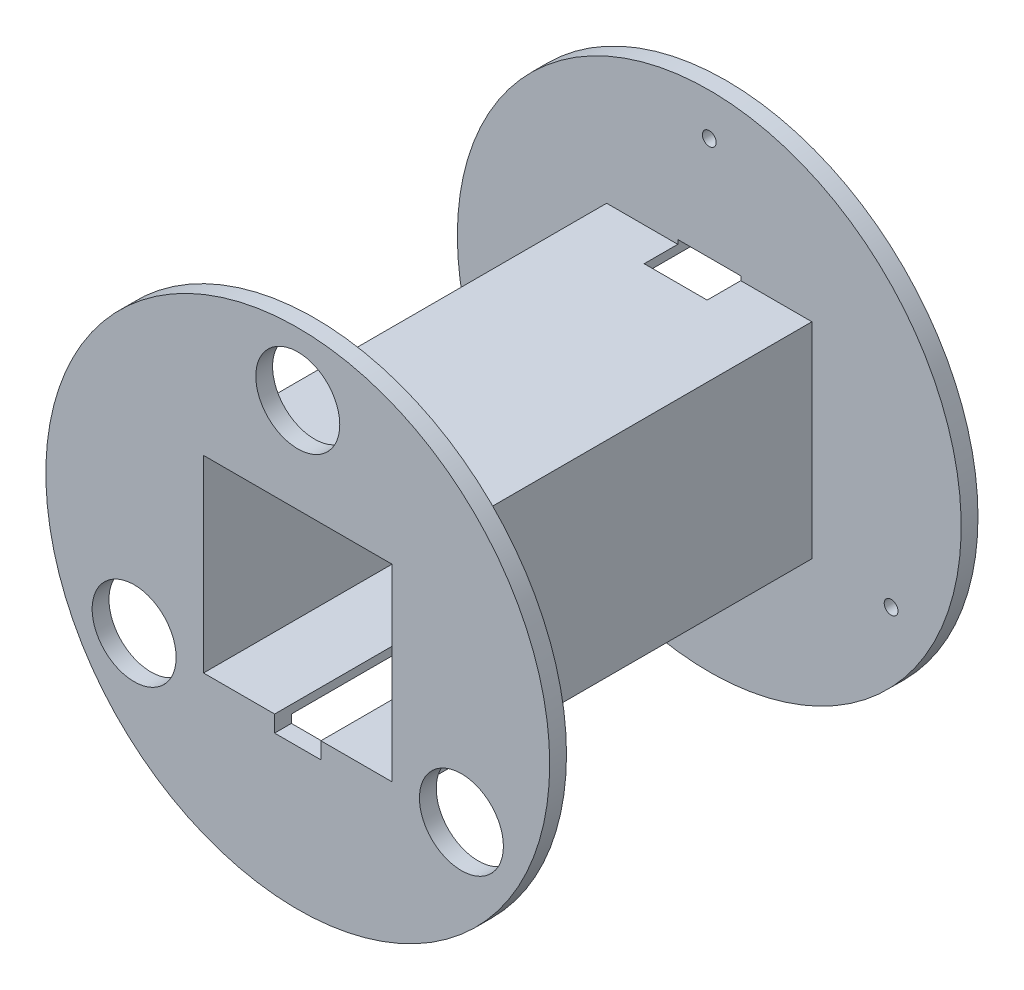
ISO-10303-21;
HEADER;
FILE_DESCRIPTION(('STEP AP214'),'2;1');
FILE_NAME('part.step','',(''),(''),'','','');
FILE_SCHEMA(('AUTOMOTIVE_DESIGN { 1 0 10303 214 1 1 1 1 }'));
ENDSEC;
DATA;
#1=APPLICATION_CONTEXT('core data for automotive mechanical design processes');
#2=APPLICATION_PROTOCOL_DEFINITION('international standard','automotive_design',2000,#1);
#3=PRODUCT_CONTEXT('',#1,'mechanical');
#4=PRODUCT('Part','Part','',(#3));
#5=PRODUCT_RELATED_PRODUCT_CATEGORY('part','',(#4));
#6=PRODUCT_DEFINITION_FORMATION('','',#4);
#7=PRODUCT_DEFINITION_CONTEXT('part definition',#1,'design');
#8=PRODUCT_DEFINITION('design','',#6,#7);
#9=PRODUCT_DEFINITION_SHAPE('','',#8);
#10=(LENGTH_UNIT() NAMED_UNIT(*) SI_UNIT(.MILLI.,.METRE.));
#11=(NAMED_UNIT(*) PLANE_ANGLE_UNIT() SI_UNIT($,.RADIAN.));
#12=(NAMED_UNIT(*) SI_UNIT($,.STERADIAN.) SOLID_ANGLE_UNIT());
#13=UNCERTAINTY_MEASURE_WITH_UNIT(LENGTH_MEASURE(1.E-05),#10,'distance_accuracy_value','');
#14=(GEOMETRIC_REPRESENTATION_CONTEXT(3) GLOBAL_UNCERTAINTY_ASSIGNED_CONTEXT((#13)) GLOBAL_UNIT_ASSIGNED_CONTEXT((#10,
#11,#12)) REPRESENTATION_CONTEXT('',''));
#15=CARTESIAN_POINT('',(0.,0.,0.));
#16=DIRECTION('',(0.,0.,1.));
#17=DIRECTION('',(1.,0.,0.));
#18=AXIS2_PLACEMENT_3D('',#15,#16,#17);
#19=CARTESIAN_POINT('',(-31.04,-31.04,345.06614690566));
#20=DIRECTION('',(0.,1.,0.));
#21=DIRECTION('',(-1.,0.,0.));
#22=AXIS2_PLACEMENT_3D('',#19,#20,#21);
#23=PLANE('',#22);
#24=DIRECTION('',(1.,0.,0.));
#25=VECTOR('',#24,1.);
#26=CARTESIAN_POINT('',(-31.04,-31.04,5.08));
#27=LINE('',#26,#25);
#28=CARTESIAN_POINT('',(-31.04,-31.04,5.08));
#29=VERTEX_POINT('',#28);
#30=CARTESIAN_POINT('',(-7.00000000000001,-31.04,5.07999999999997));
#31=VERTEX_POINT('',#30);
#32=EDGE_CURVE('E384',#29,#31,#27,.T.);
#33=ORIENTED_EDGE('',*,*,#32,.T.);
#34=DIRECTION('',(0.,0.,1.));
#35=VECTOR('',#34,1.);
#36=CARTESIAN_POINT('',(-7.00000000000001,-31.04,345.06614690566));
#37=LINE('',#36,#35);
#38=CARTESIAN_POINT('',(-7.,-31.04,124.46));
#39=VERTEX_POINT('',#38);
#40=EDGE_CURVE('E283',#31,#39,#37,.T.);
#41=ORIENTED_EDGE('',*,*,#40,.T.);
#42=DIRECTION('',(1.,0.,0.));
#43=VECTOR('',#42,1.);
#44=CARTESIAN_POINT('',(-31.04,-31.04,124.46));
#45=LINE('',#44,#43);
#46=CARTESIAN_POINT('',(-31.04,-31.04,124.46));
#47=VERTEX_POINT('',#46);
#48=EDGE_CURVE('E390',#47,#39,#45,.T.);
#49=ORIENTED_EDGE('',*,*,#48,.F.);
#50=DIRECTION('',(0.,0.,-1.));
#51=VECTOR('',#50,1.);
#52=CARTESIAN_POINT('',(-31.04,-31.04,345.06614690566));
#53=LINE('',#52,#51);
#54=EDGE_CURVE('E375',#47,#29,#53,.T.);
#55=ORIENTED_EDGE('',*,*,#54,.T.);
#56=EDGE_LOOP('',(#33,#41,#49,#55));
#57=FACE_BOUND('',#56,.T.);
#58=ADVANCED_FACE('F53',(#57),#23,.F.);
#59=CARTESIAN_POINT('',(-28.5,-28.5,210.150173055266));
#60=DIRECTION('',(0.,-1.,0.));
#61=DIRECTION('',(1.,0.,0.));
#62=AXIS2_PLACEMENT_3D('',#59,#60,#61);
#63=PLANE('',#62);
#64=DIRECTION('',(-1.,0.,0.));
#65=VECTOR('',#64,1.);
#66=CARTESIAN_POINT('',(-28.5,-28.5,129.54));
#67=LINE('',#66,#65);
#68=CARTESIAN_POINT('',(-7.,-28.5,129.54));
#69=VERTEX_POINT('',#68);
#70=CARTESIAN_POINT('',(-28.5,-28.5,129.54));
#71=VERTEX_POINT('',#70);
#72=EDGE_CURVE('E334',#69,#71,#67,.T.);
#73=ORIENTED_EDGE('',*,*,#72,.F.);
#74=DIRECTION('',(0.,0.,1.));
#75=VECTOR('',#74,1.);
#76=CARTESIAN_POINT('',(-7.,-28.5,0.));
#77=LINE('',#76,#75);
#78=CARTESIAN_POINT('',(-7.,-28.5,0.));
#79=VERTEX_POINT('',#78);
#80=EDGE_CURVE('E264',#79,#69,#77,.T.);
#81=ORIENTED_EDGE('',*,*,#80,.F.);
#82=DIRECTION('',(-1.,0.,0.));
#83=VECTOR('',#82,1.);
#84=CARTESIAN_POINT('',(-28.5,-28.5,0.));
#85=LINE('',#84,#83);
#86=CARTESIAN_POINT('',(-28.5,-28.5,0.));
#87=VERTEX_POINT('',#86);
#88=EDGE_CURVE('E342',#79,#87,#85,.T.);
#89=ORIENTED_EDGE('',*,*,#88,.T.);
#90=DIRECTION('',(0.,0.,-1.));
#91=VECTOR('',#90,1.);
#92=CARTESIAN_POINT('',(-28.5,-28.5,210.150173055266));
#93=LINE('',#92,#91);
#94=EDGE_CURVE('E348',#71,#87,#93,.T.);
#95=ORIENTED_EDGE('',*,*,#94,.F.);
#96=EDGE_LOOP('',(#73,#81,#89,#95));
#97=FACE_BOUND('',#96,.T.);
#98=ADVANCED_FACE('F440',(#97),#63,.F.);
#99=CARTESIAN_POINT('',(0.,0.,129.54));
#100=DIRECTION('',(0.,0.,-1.));
#101=DIRECTION('',(-1.,0.,0.));
#102=AXIS2_PLACEMENT_3D('',#99,#100,#101);
#103=CYLINDRICAL_SURFACE('',#102,76.2);
#104=CARTESIAN_POINT('',(0.,0.,5.08));
#105=DIRECTION('',(0.,0.,-1.));
#106=DIRECTION('',(-1.,0.,0.));
#107=AXIS2_PLACEMENT_3D('',#104,#105,#106);
#108=CIRCLE('',#107,76.2);
#109=CARTESIAN_POINT('',(-76.2,0.,5.08));
#110=VERTEX_POINT('',#109);
#111=EDGE_CURVE('E368',#110,#110,#108,.T.);
#112=ORIENTED_EDGE('',*,*,#111,.T.);
#113=EDGE_LOOP('',(#112));
#114=FACE_BOUND('',#113,.T.);
#115=CARTESIAN_POINT('',(0.,0.,0.));
#116=DIRECTION('',(0.,0.,1.));
#117=DIRECTION('',(1.,0.,0.));
#118=AXIS2_PLACEMENT_3D('',#115,#116,#117);
#119=CIRCLE('',#118,76.2);
#120=CARTESIAN_POINT('',(76.2,0.,0.));
#121=VERTEX_POINT('',#120);
#122=EDGE_CURVE('E400',#121,#121,#119,.T.);
#123=ORIENTED_EDGE('',*,*,#122,.T.);
#124=EDGE_LOOP('',(#123));
#125=FACE_BOUND('',#124,.T.);
#126=ADVANCED_FACE('F505',(#114,#125),#103,.T.);
#127=CARTESIAN_POINT('',(0.,0.,0.));
#128=DIRECTION('',(0.,0.,1.));
#129=DIRECTION('',(1.,0.,0.));
#130=AXIS2_PLACEMENT_3D('',#127,#128,#129);
#131=PLANE('',#130);
#132=CARTESIAN_POINT('',(0.,63.5,0.));
#133=DIRECTION('',(0.,0.,-1.));
#134=DIRECTION('',(-1.,0.,0.));
#135=AXIS2_PLACEMENT_3D('',#132,#133,#134);
#136=CIRCLE('',#135,2.0828);
#137=CARTESIAN_POINT('',(-2.0828,63.5,0.));
#138=VERTEX_POINT('',#137);
#139=EDGE_CURVE('E314',#138,#138,#136,.T.);
#140=ORIENTED_EDGE('',*,*,#139,.F.);
#141=EDGE_LOOP('',(#140));
#142=FACE_BOUND('',#141,.T.);
#143=CARTESIAN_POINT('',(-54.9926131403163,-31.7499999999974,0.));
#144=DIRECTION('',(0.,0.,-1.));
#145=DIRECTION('',(-1.,0.,0.));
#146=AXIS2_PLACEMENT_3D('',#143,#144,#145);
#147=CIRCLE('',#146,2.08279999999999);
#148=CARTESIAN_POINT('',(-57.0754131403163,-31.7499999999974,0.));
#149=VERTEX_POINT('',#148);
#150=EDGE_CURVE('E322',#149,#149,#147,.T.);
#151=ORIENTED_EDGE('',*,*,#150,.F.);
#152=EDGE_LOOP('',(#151));
#153=FACE_BOUND('',#152,.T.);
#154=CARTESIAN_POINT('',(54.9926131403074,-31.7500000000026,0.));
#155=DIRECTION('',(0.,0.,-1.));
#156=DIRECTION('',(-1.,0.,0.));
#157=AXIS2_PLACEMENT_3D('',#154,#155,#156);
#158=CIRCLE('',#157,2.08280000000001);
#159=CARTESIAN_POINT('',(52.9098131403074,-31.7500000000026,0.));
#160=VERTEX_POINT('',#159);
#161=EDGE_CURVE('E303',#160,#160,#158,.T.);
#162=ORIENTED_EDGE('',*,*,#161,.F.);
#163=EDGE_LOOP('',(#162));
#164=FACE_BOUND('',#163,.T.);
#165=DIRECTION('',(1.,0.,0.));
#166=VECTOR('',#165,1.);
#167=CARTESIAN_POINT('',(-28.5,28.5,0.));
#168=LINE('',#167,#166);
#169=CARTESIAN_POINT('',(9.52500000000001,28.5,0.));
#170=VERTEX_POINT('',#169);
#171=CARTESIAN_POINT('',(28.5,28.5,0.));
#172=VERTEX_POINT('',#171);
#173=EDGE_CURVE('E335',#170,#172,#168,.T.);
#174=ORIENTED_EDGE('',*,*,#173,.F.);
#175=DIRECTION('',(0.,-1.,0.));
#176=VECTOR('',#175,1.);
#177=CARTESIAN_POINT('',(9.52500000000001,24.69,0.));
#178=LINE('',#177,#176);
#179=CARTESIAN_POINT('',(9.52500000000001,32.31,0.));
#180=VERTEX_POINT('',#179);
#181=EDGE_CURVE('E219',#180,#170,#178,.T.);
#182=ORIENTED_EDGE('',*,*,#181,.F.);
#183=DIRECTION('',(1.,0.,0.));
#184=VECTOR('',#183,1.);
#185=CARTESIAN_POINT('',(-9.52499999999999,32.31,0.));
#186=LINE('',#185,#184);
#187=CARTESIAN_POINT('',(-9.52499999999999,32.31,0.));
#188=VERTEX_POINT('',#187);
#189=EDGE_CURVE('E204',#188,#180,#186,.T.);
#190=ORIENTED_EDGE('',*,*,#189,.F.);
#191=DIRECTION('',(0.,1.,0.));
#192=VECTOR('',#191,1.);
#193=CARTESIAN_POINT('',(-9.52499999999999,24.69,0.));
#194=LINE('',#193,#192);
#195=CARTESIAN_POINT('',(-9.52499999999999,28.5,0.));
#196=VERTEX_POINT('',#195);
#197=EDGE_CURVE('E211',#196,#188,#194,.T.);
#198=ORIENTED_EDGE('',*,*,#197,.F.);
#199=CARTESIAN_POINT('',(-28.5,28.5,0.));
#200=VERTEX_POINT('',#199);
#201=EDGE_CURVE('E332',#200,#196,#168,.T.);
#202=ORIENTED_EDGE('',*,*,#201,.F.);
#203=DIRECTION('',(0.,1.,0.));
#204=VECTOR('',#203,1.);
#205=CARTESIAN_POINT('',(-28.5,-28.5,0.));
#206=LINE('',#205,#204);
#207=EDGE_CURVE('E336',#87,#200,#206,.T.);
#208=ORIENTED_EDGE('',*,*,#207,.F.);
#209=ORIENTED_EDGE('',*,*,#88,.F.);
#210=DIRECTION('',(0.,-1.,0.));
#211=VECTOR('',#210,1.);
#212=CARTESIAN_POINT('',(-7.00000000000001,-33.5,0.));
#213=LINE('',#212,#211);
#214=CARTESIAN_POINT('',(-7.00000000000001,-33.5,0.));
#215=VERTEX_POINT('',#214);
#216=EDGE_CURVE('E249',#79,#215,#213,.T.);
#217=ORIENTED_EDGE('',*,*,#216,.T.);
#218=DIRECTION('',(1.,0.,0.));
#219=VECTOR('',#218,1.);
#220=CARTESIAN_POINT('',(7.,-33.5,0.));
#221=LINE('',#220,#219);
#222=CARTESIAN_POINT('',(7.,-33.5,0.));
#223=VERTEX_POINT('',#222);
#224=EDGE_CURVE('E242',#215,#223,#221,.T.);
#225=ORIENTED_EDGE('',*,*,#224,.T.);
#226=DIRECTION('',(0.,1.,0.));
#227=VECTOR('',#226,1.);
#228=CARTESIAN_POINT('',(7.,-28.5,0.));
#229=LINE('',#228,#227);
#230=CARTESIAN_POINT('',(7.,-28.5,0.));
#231=VERTEX_POINT('',#230);
#232=EDGE_CURVE('E245',#223,#231,#229,.T.);
#233=ORIENTED_EDGE('',*,*,#232,.T.);
#234=CARTESIAN_POINT('',(28.5,-28.5,0.));
#235=VERTEX_POINT('',#234);
#236=EDGE_CURVE('E339',#235,#231,#85,.T.);
#237=ORIENTED_EDGE('',*,*,#236,.F.);
#238=DIRECTION('',(0.,-1.,0.));
#239=VECTOR('',#238,1.);
#240=CARTESIAN_POINT('',(28.5,-28.5,0.));
#241=LINE('',#240,#239);
#242=EDGE_CURVE('E321',#172,#235,#241,.T.);
#243=ORIENTED_EDGE('',*,*,#242,.F.);
#244=EDGE_LOOP('',(#174,#182,#190,#198,#202,#208,#209,#217,#225,#233,#237,#243));
#245=FACE_BOUND('',#244,.T.);
#246=ORIENTED_EDGE('',*,*,#122,.F.);
#247=EDGE_LOOP('',(#246));
#248=FACE_BOUND('',#247,.T.);
#249=ADVANCED_FACE('F222',(#142,#153,#164,#245,#248),#131,.F.);
#250=CARTESIAN_POINT('',(7.,-31.04,124.46));
#251=VERTEX_POINT('',#250);
#252=CARTESIAN_POINT('',(31.04,-31.04,124.46));
#253=VERTEX_POINT('',#252);
#254=EDGE_CURVE('E389',#251,#253,#45,.T.);
#255=ORIENTED_EDGE('',*,*,#254,.F.);
#256=DIRECTION('',(0.,0.,-1.));
#257=VECTOR('',#256,1.);
#258=CARTESIAN_POINT('',(7.,-31.04,345.06614690566));
#259=LINE('',#258,#257);
#260=CARTESIAN_POINT('',(7.,-31.04,5.07999999999997));
#261=VERTEX_POINT('',#260);
#262=EDGE_CURVE('E274',#251,#261,#259,.T.);
#263=ORIENTED_EDGE('',*,*,#262,.T.);
#264=CARTESIAN_POINT('',(31.04,-31.04,5.08));
#265=VERTEX_POINT('',#264);
#266=EDGE_CURVE('E371',#261,#265,#27,.T.);
#267=ORIENTED_EDGE('',*,*,#266,.T.);
#268=DIRECTION('',(0.,0.,-1.));
#269=VECTOR('',#268,1.);
#270=CARTESIAN_POINT('',(31.04,-31.04,345.06614690566));
#271=LINE('',#270,#269);
#272=EDGE_CURVE('E393',#253,#265,#271,.T.);
#273=ORIENTED_EDGE('',*,*,#272,.F.);
#274=EDGE_LOOP('',(#255,#263,#267,#273));
#275=FACE_BOUND('',#274,.T.);
#276=ADVANCED_FACE('F473',(#275),#23,.F.);
#277=CARTESIAN_POINT('',(31.04,-31.04,345.06614690566));
#278=DIRECTION('',(-1.,0.,0.));
#279=DIRECTION('',(0.,0.,1.));
#280=AXIS2_PLACEMENT_3D('',#277,#278,#279);
#281=PLANE('',#280);
#282=ORIENTED_EDGE('',*,*,#272,.T.);
#283=DIRECTION('',(0.,1.,0.));
#284=VECTOR('',#283,1.);
#285=CARTESIAN_POINT('',(31.04,-31.04,5.08));
#286=LINE('',#285,#284);
#287=CARTESIAN_POINT('',(31.04,31.04,5.08));
#288=VERTEX_POINT('',#287);
#289=EDGE_CURVE('E380',#265,#288,#286,.T.);
#290=ORIENTED_EDGE('',*,*,#289,.T.);
#291=DIRECTION('',(0.,0.,-1.));
#292=VECTOR('',#291,1.);
#293=CARTESIAN_POINT('',(31.04,31.04,345.06614690566));
#294=LINE('',#293,#292);
#295=CARTESIAN_POINT('',(31.04,31.04,124.46));
#296=VERTEX_POINT('',#295);
#297=EDGE_CURVE('E396',#296,#288,#294,.T.);
#298=ORIENTED_EDGE('',*,*,#297,.F.);
#299=DIRECTION('',(0.,1.,0.));
#300=VECTOR('',#299,1.);
#301=CARTESIAN_POINT('',(31.04,-31.04,124.46));
#302=LINE('',#301,#300);
#303=EDGE_CURVE('E394',#253,#296,#302,.T.);
#304=ORIENTED_EDGE('',*,*,#303,.F.);
#305=EDGE_LOOP('',(#282,#290,#298,#304));
#306=FACE_BOUND('',#305,.T.);
#307=ADVANCED_FACE('F478',(#306),#281,.F.);
#308=CARTESIAN_POINT('',(-31.04,31.04,345.06614690566));
#309=DIRECTION('',(0.,1.,0.));
#310=DIRECTION('',(-1.,0.,0.));
#311=AXIS2_PLACEMENT_3D('',#308,#309,#310);
#312=PLANE('',#311);
#313=DIRECTION('',(0.,0.,-1.));
#314=VECTOR('',#313,1.);
#315=CARTESIAN_POINT('',(9.52500000000001,31.04,345.06614690566));
#316=LINE('',#315,#314);
#317=CARTESIAN_POINT('',(9.52500000000001,31.04,15.24));
#318=VERTEX_POINT('',#317);
#319=CARTESIAN_POINT('',(9.52500000000001,31.04,5.08));
#320=VERTEX_POINT('',#319);
#321=EDGE_CURVE('E239',#318,#320,#316,.T.);
#322=ORIENTED_EDGE('',*,*,#321,.F.);
#323=DIRECTION('',(-1.,0.,0.));
#324=VECTOR('',#323,1.);
#325=CARTESIAN_POINT('',(-31.04,31.04,15.24));
#326=LINE('',#325,#324);
#327=CARTESIAN_POINT('',(-9.52499999999999,31.04,15.24));
#328=VERTEX_POINT('',#327);
#329=EDGE_CURVE('E228',#318,#328,#326,.T.);
#330=ORIENTED_EDGE('',*,*,#329,.T.);
#331=DIRECTION('',(0.,0.,1.));
#332=VECTOR('',#331,1.);
#333=CARTESIAN_POINT('',(-9.52499999999999,31.04,345.06614690566));
#334=LINE('',#333,#332);
#335=CARTESIAN_POINT('',(-9.52499999999999,31.04,5.08));
#336=VERTEX_POINT('',#335);
#337=EDGE_CURVE('E234',#336,#328,#334,.T.);
#338=ORIENTED_EDGE('',*,*,#337,.F.);
#339=DIRECTION('',(1.,0.,0.));
#340=VECTOR('',#339,1.);
#341=CARTESIAN_POINT('',(-31.04,31.04,5.08));
#342=LINE('',#341,#340);
#343=CARTESIAN_POINT('',(-31.04,31.04,5.08));
#344=VERTEX_POINT('',#343);
#345=EDGE_CURVE('E376',#344,#336,#342,.T.);
#346=ORIENTED_EDGE('',*,*,#345,.F.);
#347=DIRECTION('',(0.,0.,-1.));
#348=VECTOR('',#347,1.);
#349=CARTESIAN_POINT('',(-31.04,31.04,345.06614690566));
#350=LINE('',#349,#348);
#351=CARTESIAN_POINT('',(-31.04,31.04,124.46));
#352=VERTEX_POINT('',#351);
#353=EDGE_CURVE('E407',#352,#344,#350,.T.);
#354=ORIENTED_EDGE('',*,*,#353,.F.);
#355=DIRECTION('',(1.,0.,0.));
#356=VECTOR('',#355,1.);
#357=CARTESIAN_POINT('',(-31.04,31.04,124.46));
#358=LINE('',#357,#356);
#359=EDGE_CURVE('E397',#352,#296,#358,.T.);
#360=ORIENTED_EDGE('',*,*,#359,.T.);
#361=ORIENTED_EDGE('',*,*,#297,.T.);
#362=EDGE_CURVE('E379',#320,#288,#342,.T.);
#363=ORIENTED_EDGE('',*,*,#362,.F.);
#364=EDGE_LOOP('',(#322,#330,#338,#346,#354,#360,#361,#363));
#365=FACE_BOUND('',#364,.T.);
#366=ADVANCED_FACE('F482',(#365),#312,.T.);
#367=CARTESIAN_POINT('',(-31.04,-31.04,345.06614690566));
#368=DIRECTION('',(-1.,0.,0.));
#369=DIRECTION('',(0.,0.,1.));
#370=AXIS2_PLACEMENT_3D('',#367,#368,#369);
#371=PLANE('',#370);
#372=DIRECTION('',(0.,1.,0.));
#373=VECTOR('',#372,1.);
#374=CARTESIAN_POINT('',(-31.04,-31.04,124.46));
#375=LINE('',#374,#373);
#376=EDGE_CURVE('E383',#47,#352,#375,.T.);
#377=ORIENTED_EDGE('',*,*,#376,.T.);
#378=ORIENTED_EDGE('',*,*,#353,.T.);
#379=DIRECTION('',(0.,1.,0.));
#380=VECTOR('',#379,1.);
#381=CARTESIAN_POINT('',(-31.04,-31.04,5.08));
#382=LINE('',#381,#380);
#383=EDGE_CURVE('E372',#29,#344,#382,.T.);
#384=ORIENTED_EDGE('',*,*,#383,.F.);
#385=ORIENTED_EDGE('',*,*,#54,.F.);
#386=EDGE_LOOP('',(#377,#378,#384,#385));
#387=FACE_BOUND('',#386,.T.);
#388=ADVANCED_FACE('F486',(#387),#371,.T.);
#389=CARTESIAN_POINT('',(0.,0.,5.08));
#390=DIRECTION('',(0.,0.,-1.));
#391=DIRECTION('',(-1.,0.,0.));
#392=AXIS2_PLACEMENT_3D('',#389,#390,#391);
#393=PLANE('',#392);
#394=CARTESIAN_POINT('',(0.,63.5,5.08));
#395=DIRECTION('',(0.,0.,-1.));
#396=DIRECTION('',(-1.,0.,0.));
#397=AXIS2_PLACEMENT_3D('',#394,#395,#396);
#398=CIRCLE('',#397,2.0828);
#399=CARTESIAN_POINT('',(-2.0828,63.5,5.08));
#400=VERTEX_POINT('',#399);
#401=EDGE_CURVE('E317',#400,#400,#398,.F.);
#402=ORIENTED_EDGE('',*,*,#401,.F.);
#403=EDGE_LOOP('',(#402));
#404=FACE_BOUND('',#403,.T.);
#405=CARTESIAN_POINT('',(-54.9926131403163,-31.7499999999974,5.08));
#406=DIRECTION('',(0.,0.,-1.));
#407=DIRECTION('',(-1.,0.,0.));
#408=AXIS2_PLACEMENT_3D('',#405,#406,#407);
#409=CIRCLE('',#408,2.08279999999999);
#410=CARTESIAN_POINT('',(-57.0754131403163,-31.7499999999974,5.08));
#411=VERTEX_POINT('',#410);
#412=EDGE_CURVE('E318',#411,#411,#409,.F.);
#413=ORIENTED_EDGE('',*,*,#412,.F.);
#414=EDGE_LOOP('',(#413));
#415=FACE_BOUND('',#414,.T.);
#416=CARTESIAN_POINT('',(54.9926131403074,-31.7500000000026,5.08));
#417=DIRECTION('',(0.,0.,-1.));
#418=DIRECTION('',(-1.,0.,0.));
#419=AXIS2_PLACEMENT_3D('',#416,#417,#418);
#420=CIRCLE('',#419,2.08280000000001);
#421=CARTESIAN_POINT('',(52.9098131403074,-31.7500000000026,5.08));
#422=VERTEX_POINT('',#421);
#423=EDGE_CURVE('E325',#422,#422,#420,.F.);
#424=ORIENTED_EDGE('',*,*,#423,.F.);
#425=EDGE_LOOP('',(#424));
#426=FACE_BOUND('',#425,.T.);
#427=ORIENTED_EDGE('',*,*,#111,.F.);
#428=EDGE_LOOP('',(#427));
#429=FACE_BOUND('',#428,.T.);
#430=DIRECTION('',(1.,0.,0.));
#431=VECTOR('',#430,1.);
#432=CARTESIAN_POINT('',(0.,32.31,5.08));
#433=LINE('',#432,#431);
#434=CARTESIAN_POINT('',(-9.52499999999999,32.31,5.08));
#435=VERTEX_POINT('',#434);
#436=CARTESIAN_POINT('',(9.52500000000001,32.31,5.08));
#437=VERTEX_POINT('',#436);
#438=EDGE_CURVE('E13',#435,#437,#433,.T.);
#439=ORIENTED_EDGE('',*,*,#438,.T.);
#440=DIRECTION('',(0.,-1.,0.));
#441=VECTOR('',#440,1.);
#442=CARTESIAN_POINT('',(9.52500000000001,0.,5.08));
#443=LINE('',#442,#441);
#444=EDGE_CURVE('E236',#437,#320,#443,.T.);
#445=ORIENTED_EDGE('',*,*,#444,.T.);
#446=ORIENTED_EDGE('',*,*,#362,.T.);
#447=ORIENTED_EDGE('',*,*,#289,.F.);
#448=ORIENTED_EDGE('',*,*,#266,.F.);
#449=DIRECTION('',(0.,-1.,0.));
#450=VECTOR('',#449,1.);
#451=CARTESIAN_POINT('',(6.99999999999999,0.,5.08));
#452=LINE('',#451,#450);
#453=CARTESIAN_POINT('',(7.,-33.5,5.08));
#454=VERTEX_POINT('',#453);
#455=EDGE_CURVE('E277',#261,#454,#452,.T.);
#456=ORIENTED_EDGE('',*,*,#455,.T.);
#457=DIRECTION('',(-1.,0.,0.));
#458=VECTOR('',#457,1.);
#459=CARTESIAN_POINT('',(0.,-33.5,5.08));
#460=LINE('',#459,#458);
#461=CARTESIAN_POINT('',(-7.00000000000001,-33.5,5.08));
#462=VERTEX_POINT('',#461);
#463=EDGE_CURVE('E292',#454,#462,#460,.T.);
#464=ORIENTED_EDGE('',*,*,#463,.T.);
#465=DIRECTION('',(0.,1.,0.));
#466=VECTOR('',#465,1.);
#467=CARTESIAN_POINT('',(-7.,0.,5.08));
#468=LINE('',#467,#466);
#469=EDGE_CURVE('E286',#462,#31,#468,.T.);
#470=ORIENTED_EDGE('',*,*,#469,.T.);
#471=ORIENTED_EDGE('',*,*,#32,.F.);
#472=ORIENTED_EDGE('',*,*,#383,.T.);
#473=ORIENTED_EDGE('',*,*,#345,.T.);
#474=DIRECTION('',(0.,1.,0.));
#475=VECTOR('',#474,1.);
#476=CARTESIAN_POINT('',(-9.525,0.,5.08));
#477=LINE('',#476,#475);
#478=EDGE_CURVE('E232',#336,#435,#477,.T.);
#479=ORIENTED_EDGE('',*,*,#478,.T.);
#480=EDGE_LOOP('',(#439,#445,#446,#447,#448,#456,#464,#470,#471,#472,#473,#479));
#481=FACE_BOUND('',#480,.T.);
#482=ADVANCED_FACE('F467',(#404,#415,#426,#429,#481),#393,.F.);
#483=CARTESIAN_POINT('',(0.,0.,124.46));
#484=DIRECTION('',(0.,0.,1.));
#485=DIRECTION('',(1.,0.,0.));
#486=AXIS2_PLACEMENT_3D('',#483,#484,#485);
#487=PLANE('',#486);
#488=CARTESIAN_POINT('',(0.,57.15,124.46));
#489=DIRECTION('',(0.,0.,1.));
#490=DIRECTION('',(1.,0.,0.));
#491=AXIS2_PLACEMENT_3D('',#488,#489,#490);
#492=CIRCLE('',#491,12.7);
#493=CARTESIAN_POINT('',(12.7,57.15,124.46));
#494=VERTEX_POINT('',#493);
#495=EDGE_CURVE('E299',#494,#494,#492,.F.);
#496=ORIENTED_EDGE('',*,*,#495,.F.);
#497=EDGE_LOOP('',(#496));
#498=FACE_BOUND('',#497,.T.);
#499=CARTESIAN_POINT('',(49.4933518262831,-28.5749999999986,124.46));
#500=DIRECTION('',(0.,0.,1.));
#501=DIRECTION('',(1.,0.,0.));
#502=AXIS2_PLACEMENT_3D('',#499,#500,#501);
#503=CIRCLE('',#502,12.7000000000022);
#504=CARTESIAN_POINT('',(62.1933518262853,-28.5749999999986,124.46));
#505=VERTEX_POINT('',#504);
#506=EDGE_CURVE('E300',#505,#505,#503,.F.);
#507=ORIENTED_EDGE('',*,*,#506,.F.);
#508=EDGE_LOOP('',(#507));
#509=FACE_BOUND('',#508,.T.);
#510=CARTESIAN_POINT('',(-49.4933518262782,-28.5750000000014,124.46));
#511=DIRECTION('',(0.,0.,1.));
#512=DIRECTION('',(1.,0.,0.));
#513=AXIS2_PLACEMENT_3D('',#510,#511,#512);
#514=CIRCLE('',#513,12.7000000000033);
#515=CARTESIAN_POINT('',(-36.793351826275,-28.5750000000014,124.46));
#516=VERTEX_POINT('',#515);
#517=EDGE_CURVE('E307',#516,#516,#514,.F.);
#518=ORIENTED_EDGE('',*,*,#517,.F.);
#519=EDGE_LOOP('',(#518));
#520=FACE_BOUND('',#519,.T.);
#521=CARTESIAN_POINT('',(0.,0.,124.46));
#522=DIRECTION('',(0.,0.,1.));
#523=DIRECTION('',(1.,0.,0.));
#524=AXIS2_PLACEMENT_3D('',#521,#522,#523);
#525=CIRCLE('',#524,76.2);
#526=CARTESIAN_POINT('',(76.2,0.,124.46));
#527=VERTEX_POINT('',#526);
#528=EDGE_CURVE('E367',#527,#527,#525,.F.);
#529=ORIENTED_EDGE('',*,*,#528,.T.);
#530=EDGE_LOOP('',(#529));
#531=FACE_BOUND('',#530,.T.);
#532=ORIENTED_EDGE('',*,*,#48,.T.);
#533=DIRECTION('',(0.,-1.,0.));
#534=VECTOR('',#533,1.);
#535=CARTESIAN_POINT('',(-7.,0.,124.46));
#536=LINE('',#535,#534);
#537=CARTESIAN_POINT('',(-7.00000000000001,-33.5,124.46));
#538=VERTEX_POINT('',#537);
#539=EDGE_CURVE('E280',#39,#538,#536,.T.);
#540=ORIENTED_EDGE('',*,*,#539,.T.);
#541=DIRECTION('',(1.,0.,0.));
#542=VECTOR('',#541,1.);
#543=CARTESIAN_POINT('',(0.,-33.5,124.46));
#544=LINE('',#543,#542);
#545=CARTESIAN_POINT('',(7.,-33.5,124.46));
#546=VERTEX_POINT('',#545);
#547=EDGE_CURVE('E289',#538,#546,#544,.T.);
#548=ORIENTED_EDGE('',*,*,#547,.T.);
#549=DIRECTION('',(0.,1.,0.));
#550=VECTOR('',#549,1.);
#551=CARTESIAN_POINT('',(6.99999999999999,0.,124.46));
#552=LINE('',#551,#550);
#553=EDGE_CURVE('E262',#546,#251,#552,.T.);
#554=ORIENTED_EDGE('',*,*,#553,.T.);
#555=ORIENTED_EDGE('',*,*,#254,.T.);
#556=ORIENTED_EDGE('',*,*,#303,.T.);
#557=ORIENTED_EDGE('',*,*,#359,.F.);
#558=ORIENTED_EDGE('',*,*,#376,.F.);
#559=EDGE_LOOP('',(#532,#540,#548,#554,#555,#556,#557,#558));
#560=FACE_BOUND('',#559,.T.);
#561=ADVANCED_FACE('F460',(#498,#509,#520,#531,#560),#487,.F.);
#562=CARTESIAN_POINT('',(0.,0.,129.54));
#563=DIRECTION('',(0.,0.,1.));
#564=DIRECTION('',(1.,0.,0.));
#565=AXIS2_PLACEMENT_3D('',#562,#563,#564);
#566=PLANE('',#565);
#567=DIRECTION('',(0.,-1.,0.));
#568=VECTOR('',#567,1.);
#569=CARTESIAN_POINT('',(-7.00000000000001,-33.5,129.54));
#570=LINE('',#569,#568);
#571=CARTESIAN_POINT('',(-7.00000000000001,-33.5,129.54));
#572=VERTEX_POINT('',#571);
#573=EDGE_CURVE('E246',#69,#572,#570,.T.);
#574=ORIENTED_EDGE('',*,*,#573,.F.);
#575=ORIENTED_EDGE('',*,*,#72,.T.);
#576=DIRECTION('',(0.,1.,0.));
#577=VECTOR('',#576,1.);
#578=CARTESIAN_POINT('',(-28.5,-28.5,129.54));
#579=LINE('',#578,#577);
#580=CARTESIAN_POINT('',(-28.5,28.5,129.54));
#581=VERTEX_POINT('',#580);
#582=EDGE_CURVE('E358',#71,#581,#579,.T.);
#583=ORIENTED_EDGE('',*,*,#582,.T.);
#584=DIRECTION('',(1.,0.,0.));
#585=VECTOR('',#584,1.);
#586=CARTESIAN_POINT('',(-28.5,28.5,129.54));
#587=LINE('',#586,#585);
#588=CARTESIAN_POINT('',(28.5,28.5,129.54));
#589=VERTEX_POINT('',#588);
#590=EDGE_CURVE('E354',#581,#589,#587,.T.);
#591=ORIENTED_EDGE('',*,*,#590,.T.);
#592=DIRECTION('',(0.,-1.,0.));
#593=VECTOR('',#592,1.);
#594=CARTESIAN_POINT('',(28.5,-28.5,129.54));
#595=LINE('',#594,#593);
#596=CARTESIAN_POINT('',(28.5,-28.5,129.54));
#597=VERTEX_POINT('',#596);
#598=EDGE_CURVE('E349',#589,#597,#595,.T.);
#599=ORIENTED_EDGE('',*,*,#598,.T.);
#600=CARTESIAN_POINT('',(7.,-28.5,129.54));
#601=VERTEX_POINT('',#600);
#602=EDGE_CURVE('E345',#597,#601,#67,.T.);
#603=ORIENTED_EDGE('',*,*,#602,.T.);
#604=DIRECTION('',(0.,1.,0.));
#605=VECTOR('',#604,1.);
#606=CARTESIAN_POINT('',(7.,-28.5,129.54));
#607=LINE('',#606,#605);
#608=CARTESIAN_POINT('',(7.,-33.5,129.54));
#609=VERTEX_POINT('',#608);
#610=EDGE_CURVE('E255',#609,#601,#607,.T.);
#611=ORIENTED_EDGE('',*,*,#610,.F.);
#612=DIRECTION('',(1.,0.,0.));
#613=VECTOR('',#612,1.);
#614=CARTESIAN_POINT('',(7.,-33.5,129.54));
#615=LINE('',#614,#613);
#616=EDGE_CURVE('E241',#572,#609,#615,.T.);
#617=ORIENTED_EDGE('',*,*,#616,.F.);
#618=EDGE_LOOP('',(#574,#575,#583,#591,#599,#603,#611,#617));
#619=FACE_BOUND('',#618,.T.);
#620=CARTESIAN_POINT('',(0.,57.15,129.54));
#621=DIRECTION('',(0.,0.,1.));
#622=DIRECTION('',(1.,0.,0.));
#623=AXIS2_PLACEMENT_3D('',#620,#621,#622);
#624=CIRCLE('',#623,12.7);
#625=CARTESIAN_POINT('',(12.7,57.15,129.54));
#626=VERTEX_POINT('',#625);
#627=EDGE_CURVE('E296',#626,#626,#624,.T.);
#628=ORIENTED_EDGE('',*,*,#627,.F.);
#629=EDGE_LOOP('',(#628));
#630=FACE_BOUND('',#629,.T.);
#631=CARTESIAN_POINT('',(49.4933518262831,-28.5749999999986,129.54));
#632=DIRECTION('',(0.,0.,1.));
#633=DIRECTION('',(1.,0.,0.));
#634=AXIS2_PLACEMENT_3D('',#631,#632,#633);
#635=CIRCLE('',#634,12.7000000000022);
#636=CARTESIAN_POINT('',(62.1933518262853,-28.5749999999986,129.54));
#637=VERTEX_POINT('',#636);
#638=EDGE_CURVE('E304',#637,#637,#635,.T.);
#639=ORIENTED_EDGE('',*,*,#638,.F.);
#640=EDGE_LOOP('',(#639));
#641=FACE_BOUND('',#640,.T.);
#642=CARTESIAN_POINT('',(-49.4933518262782,-28.5750000000014,129.54));
#643=DIRECTION('',(0.,0.,1.));
#644=DIRECTION('',(1.,0.,0.));
#645=AXIS2_PLACEMENT_3D('',#642,#643,#644);
#646=CIRCLE('',#645,12.7000000000033);
#647=CARTESIAN_POINT('',(-36.793351826275,-28.5750000000014,129.54));
#648=VERTEX_POINT('',#647);
#649=EDGE_CURVE('E295',#648,#648,#646,.T.);
#650=ORIENTED_EDGE('',*,*,#649,.F.);
#651=EDGE_LOOP('',(#650));
#652=FACE_BOUND('',#651,.T.);
#653=CARTESIAN_POINT('',(0.,0.,129.54));
#654=DIRECTION('',(0.,0.,1.));
#655=DIRECTION('',(1.,0.,0.));
#656=AXIS2_PLACEMENT_3D('',#653,#654,#655);
#657=CIRCLE('',#656,76.2);
#658=CARTESIAN_POINT('',(76.2,0.,129.54));
#659=VERTEX_POINT('',#658);
#660=EDGE_CURVE('E410',#659,#659,#657,.T.);
#661=ORIENTED_EDGE('',*,*,#660,.T.);
#662=EDGE_LOOP('',(#661));
#663=FACE_BOUND('',#662,.T.);
#664=ADVANCED_FACE('F431',(#619,#630,#641,#652,#663),#566,.T.);
#665=ORIENTED_EDGE('',*,*,#528,.F.);
#666=EDGE_LOOP('',(#665));
#667=FACE_BOUND('',#666,.T.);
#668=ORIENTED_EDGE('',*,*,#660,.F.);
#669=EDGE_LOOP('',(#668));
#670=FACE_BOUND('',#669,.T.);
#671=ADVANCED_FACE('F55',(#667,#670),#103,.T.);
#672=ORIENTED_EDGE('',*,*,#236,.T.);
#673=DIRECTION('',(0.,0.,1.));
#674=VECTOR('',#673,1.);
#675=CARTESIAN_POINT('',(7.,-28.5,0.));
#676=LINE('',#675,#674);
#677=EDGE_CURVE('E266',#231,#601,#676,.T.);
#678=ORIENTED_EDGE('',*,*,#677,.T.);
#679=ORIENTED_EDGE('',*,*,#602,.F.);
#680=DIRECTION('',(0.,0.,-1.));
#681=VECTOR('',#680,1.);
#682=CARTESIAN_POINT('',(28.5,-28.5,210.150173055266));
#683=LINE('',#682,#681);
#684=EDGE_CURVE('E352',#597,#235,#683,.T.);
#685=ORIENTED_EDGE('',*,*,#684,.T.);
#686=EDGE_LOOP('',(#672,#678,#679,#685));
#687=FACE_BOUND('',#686,.T.);
#688=ADVANCED_FACE('F452',(#687),#63,.F.);
#689=CARTESIAN_POINT('',(-28.5,-28.5,210.150173055266));
#690=DIRECTION('',(-1.,0.,0.));
#691=DIRECTION('',(0.,0.,1.));
#692=AXIS2_PLACEMENT_3D('',#689,#690,#691);
#693=PLANE('',#692);
#694=ORIENTED_EDGE('',*,*,#94,.T.);
#695=ORIENTED_EDGE('',*,*,#207,.T.);
#696=DIRECTION('',(0.,0.,-1.));
#697=VECTOR('',#696,1.);
#698=CARTESIAN_POINT('',(-28.5,28.5,210.150173055266));
#699=LINE('',#698,#697);
#700=EDGE_CURVE('E357',#581,#200,#699,.T.);
#701=ORIENTED_EDGE('',*,*,#700,.F.);
#702=ORIENTED_EDGE('',*,*,#582,.F.);
#703=EDGE_LOOP('',(#694,#695,#701,#702));
#704=FACE_BOUND('',#703,.T.);
#705=ADVANCED_FACE('F437',(#704),#693,.F.);
#706=CARTESIAN_POINT('',(-28.5,28.5,210.150173055266));
#707=DIRECTION('',(0.,1.,0.));
#708=DIRECTION('',(-1.,0.,0.));
#709=AXIS2_PLACEMENT_3D('',#706,#707,#708);
#710=PLANE('',#709);
#711=DIRECTION('',(-1.,0.,0.));
#712=VECTOR('',#711,1.);
#713=CARTESIAN_POINT('',(-28.5,28.5,15.24));
#714=LINE('',#713,#712);
#715=CARTESIAN_POINT('',(9.52500000000001,28.5,15.24));
#716=VERTEX_POINT('',#715);
#717=CARTESIAN_POINT('',(-9.52499999999999,28.5,15.24));
#718=VERTEX_POINT('',#717);
#719=EDGE_CURVE('E413',#716,#718,#714,.T.);
#720=ORIENTED_EDGE('',*,*,#719,.F.);
#721=DIRECTION('',(0.,0.,-1.));
#722=VECTOR('',#721,1.);
#723=CARTESIAN_POINT('',(9.525,28.5,210.150173055266));
#724=LINE('',#723,#722);
#725=EDGE_CURVE('E61',#716,#170,#724,.T.);
#726=ORIENTED_EDGE('',*,*,#725,.T.);
#727=ORIENTED_EDGE('',*,*,#173,.T.);
#728=DIRECTION('',(0.,0.,-1.));
#729=VECTOR('',#728,1.);
#730=CARTESIAN_POINT('',(28.5,28.5,210.150173055266));
#731=LINE('',#730,#729);
#732=EDGE_CURVE('E353',#589,#172,#731,.T.);
#733=ORIENTED_EDGE('',*,*,#732,.F.);
#734=ORIENTED_EDGE('',*,*,#590,.F.);
#735=ORIENTED_EDGE('',*,*,#700,.T.);
#736=ORIENTED_EDGE('',*,*,#201,.T.);
#737=DIRECTION('',(0.,0.,1.));
#738=VECTOR('',#737,1.);
#739=CARTESIAN_POINT('',(-9.525,28.5,210.150173055266));
#740=LINE('',#739,#738);
#741=EDGE_CURVE('E215',#196,#718,#740,.T.);
#742=ORIENTED_EDGE('',*,*,#741,.T.);
#743=EDGE_LOOP('',(#720,#726,#727,#733,#734,#735,#736,#742));
#744=FACE_BOUND('',#743,.T.);
#745=ADVANCED_FACE('F420',(#744),#710,.F.);
#746=CARTESIAN_POINT('',(28.5,-28.5,210.150173055266));
#747=DIRECTION('',(1.,0.,0.));
#748=DIRECTION('',(0.,1.,0.));
#749=AXIS2_PLACEMENT_3D('',#746,#747,#748);
#750=PLANE('',#749);
#751=ORIENTED_EDGE('',*,*,#732,.T.);
#752=ORIENTED_EDGE('',*,*,#242,.T.);
#753=ORIENTED_EDGE('',*,*,#684,.F.);
#754=ORIENTED_EDGE('',*,*,#598,.F.);
#755=EDGE_LOOP('',(#751,#752,#753,#754));
#756=FACE_BOUND('',#755,.T.);
#757=ADVANCED_FACE('F426',(#756),#750,.F.);
#758=CARTESIAN_POINT('',(54.9926131403074,-31.7500000000026,10.9710480154214));
#759=DIRECTION('',(0.,0.,-1.));
#760=DIRECTION('',(-1.,0.,0.));
#761=AXIS2_PLACEMENT_3D('',#758,#759,#760);
#762=CYLINDRICAL_SURFACE('',#761,2.08280000000001);
#763=ORIENTED_EDGE('',*,*,#423,.T.);
#764=EDGE_LOOP('',(#763));
#765=FACE_BOUND('',#764,.T.);
#766=ORIENTED_EDGE('',*,*,#161,.T.);
#767=EDGE_LOOP('',(#766));
#768=FACE_BOUND('',#767,.T.);
#769=ADVANCED_FACE('F651',(#765,#768),#762,.F.);
#770=CARTESIAN_POINT('',(-54.9926131403163,-31.7499999999974,10.9710480154214));
#771=DIRECTION('',(0.,0.,-1.));
#772=DIRECTION('',(-1.,0.,0.));
#773=AXIS2_PLACEMENT_3D('',#770,#771,#772);
#774=CYLINDRICAL_SURFACE('',#773,2.08279999999999);
#775=ORIENTED_EDGE('',*,*,#412,.T.);
#776=EDGE_LOOP('',(#775));
#777=FACE_BOUND('',#776,.T.);
#778=ORIENTED_EDGE('',*,*,#150,.T.);
#779=EDGE_LOOP('',(#778));
#780=FACE_BOUND('',#779,.T.);
#781=ADVANCED_FACE('F643',(#777,#780),#774,.F.);
#782=CARTESIAN_POINT('',(0.,63.5,10.9710480154214));
#783=DIRECTION('',(0.,0.,-1.));
#784=DIRECTION('',(-1.,0.,0.));
#785=AXIS2_PLACEMENT_3D('',#782,#783,#784);
#786=CYLINDRICAL_SURFACE('',#785,2.0828);
#787=ORIENTED_EDGE('',*,*,#401,.T.);
#788=EDGE_LOOP('',(#787));
#789=FACE_BOUND('',#788,.T.);
#790=ORIENTED_EDGE('',*,*,#139,.T.);
#791=EDGE_LOOP('',(#790));
#792=FACE_BOUND('',#791,.T.);
#793=ADVANCED_FACE('F635',(#789,#792),#786,.F.);
#794=CARTESIAN_POINT('',(-49.4933518262782,-28.5750000000014,88.5389755157142));
#795=DIRECTION('',(0.,0.,1.));
#796=DIRECTION('',(1.,0.,0.));
#797=AXIS2_PLACEMENT_3D('',#794,#795,#796);
#798=CYLINDRICAL_SURFACE('',#797,12.7000000000033);
#799=ORIENTED_EDGE('',*,*,#517,.T.);
#800=EDGE_LOOP('',(#799));
#801=FACE_BOUND('',#800,.T.);
#802=ORIENTED_EDGE('',*,*,#649,.T.);
#803=EDGE_LOOP('',(#802));
#804=FACE_BOUND('',#803,.T.);
#805=ADVANCED_FACE('F627',(#801,#804),#798,.F.);
#806=CARTESIAN_POINT('',(49.4933518262831,-28.5749999999986,88.5389755157142));
#807=DIRECTION('',(0.,0.,1.));
#808=DIRECTION('',(1.,0.,0.));
#809=AXIS2_PLACEMENT_3D('',#806,#807,#808);
#810=CYLINDRICAL_SURFACE('',#809,12.7000000000022);
#811=ORIENTED_EDGE('',*,*,#506,.T.);
#812=EDGE_LOOP('',(#811));
#813=FACE_BOUND('',#812,.T.);
#814=ORIENTED_EDGE('',*,*,#638,.T.);
#815=EDGE_LOOP('',(#814));
#816=FACE_BOUND('',#815,.T.);
#817=ADVANCED_FACE('F619',(#813,#816),#810,.F.);
#818=CARTESIAN_POINT('',(0.,57.15,88.5389755157142));
#819=DIRECTION('',(0.,0.,1.));
#820=DIRECTION('',(1.,0.,0.));
#821=AXIS2_PLACEMENT_3D('',#818,#819,#820);
#822=CYLINDRICAL_SURFACE('',#821,12.7);
#823=ORIENTED_EDGE('',*,*,#495,.T.);
#824=EDGE_LOOP('',(#823));
#825=FACE_BOUND('',#824,.T.);
#826=ORIENTED_EDGE('',*,*,#627,.T.);
#827=EDGE_LOOP('',(#826));
#828=FACE_BOUND('',#827,.T.);
#829=ADVANCED_FACE('F613',(#825,#828),#822,.F.);
#830=CARTESIAN_POINT('',(7.,-33.5,0.));
#831=DIRECTION('',(0.,-1.,0.));
#832=DIRECTION('',(0.,0.,-1.));
#833=AXIS2_PLACEMENT_3D('',#830,#831,#832);
#834=PLANE('',#833);
#835=DIRECTION('',(0.,0.,1.));
#836=VECTOR('',#835,1.);
#837=CARTESIAN_POINT('',(7.,-33.5,0.));
#838=LINE('',#837,#836);
#839=EDGE_CURVE('E269',#223,#454,#838,.T.);
#840=ORIENTED_EDGE('',*,*,#839,.F.);
#841=ORIENTED_EDGE('',*,*,#224,.F.);
#842=DIRECTION('',(0.,0.,1.));
#843=VECTOR('',#842,1.);
#844=CARTESIAN_POINT('',(-7.00000000000001,-33.5,0.));
#845=LINE('',#844,#843);
#846=EDGE_CURVE('E259',#215,#462,#845,.T.);
#847=ORIENTED_EDGE('',*,*,#846,.T.);
#848=ORIENTED_EDGE('',*,*,#463,.F.);
#849=EDGE_LOOP('',(#840,#841,#847,#848));
#850=FACE_BOUND('',#849,.T.);
#851=ADVANCED_FACE('F447',(#850),#834,.F.);
#852=EDGE_CURVE('E263',#538,#572,#845,.T.);
#853=ORIENTED_EDGE('',*,*,#852,.T.);
#854=ORIENTED_EDGE('',*,*,#616,.T.);
#855=EDGE_CURVE('E252',#546,#609,#838,.T.);
#856=ORIENTED_EDGE('',*,*,#855,.F.);
#857=ORIENTED_EDGE('',*,*,#547,.F.);
#858=EDGE_LOOP('',(#853,#854,#856,#857));
#859=FACE_BOUND('',#858,.T.);
#860=ADVANCED_FACE('F457',(#859),#834,.F.);
#861=CARTESIAN_POINT('',(-7.00000000000001,-33.5,0.));
#862=DIRECTION('',(-1.,0.,0.));
#863=DIRECTION('',(0.,-1.,0.));
#864=AXIS2_PLACEMENT_3D('',#861,#862,#863);
#865=PLANE('',#864);
#866=ORIENTED_EDGE('',*,*,#846,.F.);
#867=ORIENTED_EDGE('',*,*,#216,.F.);
#868=ORIENTED_EDGE('',*,*,#80,.T.);
#869=ORIENTED_EDGE('',*,*,#573,.T.);
#870=ORIENTED_EDGE('',*,*,#852,.F.);
#871=ORIENTED_EDGE('',*,*,#539,.F.);
#872=ORIENTED_EDGE('',*,*,#40,.F.);
#873=ORIENTED_EDGE('',*,*,#469,.F.);
#874=EDGE_LOOP('',(#866,#867,#868,#869,#870,#871,#872,#873));
#875=FACE_BOUND('',#874,.T.);
#876=ADVANCED_FACE('F445',(#875),#865,.F.);
#877=CARTESIAN_POINT('',(7.,-28.5,0.));
#878=DIRECTION('',(1.,0.,0.));
#879=DIRECTION('',(0.,1.,0.));
#880=AXIS2_PLACEMENT_3D('',#877,#878,#879);
#881=PLANE('',#880);
#882=ORIENTED_EDGE('',*,*,#262,.F.);
#883=ORIENTED_EDGE('',*,*,#553,.F.);
#884=ORIENTED_EDGE('',*,*,#855,.T.);
#885=ORIENTED_EDGE('',*,*,#610,.T.);
#886=ORIENTED_EDGE('',*,*,#677,.F.);
#887=ORIENTED_EDGE('',*,*,#232,.F.);
#888=ORIENTED_EDGE('',*,*,#839,.T.);
#889=ORIENTED_EDGE('',*,*,#455,.F.);
#890=EDGE_LOOP('',(#882,#883,#884,#885,#886,#887,#888,#889));
#891=FACE_BOUND('',#890,.T.);
#892=ADVANCED_FACE('F450',(#891),#881,.F.);
#893=CARTESIAN_POINT('',(-9.52499999999999,32.31,15.24));
#894=DIRECTION('',(0.,1.,0.));
#895=DIRECTION('',(0.,0.,1.));
#896=AXIS2_PLACEMENT_3D('',#893,#894,#895);
#897=PLANE('',#896);
#898=DIRECTION('',(0.,0.,-1.));
#899=VECTOR('',#898,1.);
#900=CARTESIAN_POINT('',(-9.52499999999999,32.31,15.24));
#901=LINE('',#900,#899);
#902=EDGE_CURVE('E68',#435,#188,#901,.T.);
#903=ORIENTED_EDGE('',*,*,#902,.T.);
#904=ORIENTED_EDGE('',*,*,#189,.T.);
#905=DIRECTION('',(0.,0.,-1.));
#906=VECTOR('',#905,1.);
#907=CARTESIAN_POINT('',(9.52500000000001,32.31,15.24));
#908=LINE('',#907,#906);
#909=EDGE_CURVE('E207',#437,#180,#908,.T.);
#910=ORIENTED_EDGE('',*,*,#909,.F.);
#911=ORIENTED_EDGE('',*,*,#438,.F.);
#912=EDGE_LOOP('',(#903,#904,#910,#911));
#913=FACE_BOUND('',#912,.T.);
#914=ADVANCED_FACE('F201',(#913),#897,.F.);
#915=CARTESIAN_POINT('',(9.52500000000001,24.69,15.24));
#916=DIRECTION('',(1.,0.,0.));
#917=DIRECTION('',(0.,0.,-1.));
#918=AXIS2_PLACEMENT_3D('',#915,#916,#917);
#919=PLANE('',#918);
#920=ORIENTED_EDGE('',*,*,#321,.T.);
#921=ORIENTED_EDGE('',*,*,#444,.F.);
#922=ORIENTED_EDGE('',*,*,#909,.T.);
#923=ORIENTED_EDGE('',*,*,#181,.T.);
#924=ORIENTED_EDGE('',*,*,#725,.F.);
#925=DIRECTION('',(0.,-1.,0.));
#926=VECTOR('',#925,1.);
#927=CARTESIAN_POINT('',(9.52500000000001,24.69,15.24));
#928=LINE('',#927,#926);
#929=EDGE_CURVE('E76',#318,#716,#928,.T.);
#930=ORIENTED_EDGE('',*,*,#929,.F.);
#931=EDGE_LOOP('',(#920,#921,#922,#923,#924,#930));
#932=FACE_BOUND('',#931,.T.);
#933=ADVANCED_FACE('F489',(#932),#919,.F.);
#934=CARTESIAN_POINT('',(-9.52499999999999,24.69,15.24));
#935=DIRECTION('',(-1.,0.,0.));
#936=DIRECTION('',(0.,-1.,0.));
#937=AXIS2_PLACEMENT_3D('',#934,#935,#936);
#938=PLANE('',#937);
#939=ORIENTED_EDGE('',*,*,#337,.T.);
#940=DIRECTION('',(0.,1.,0.));
#941=VECTOR('',#940,1.);
#942=CARTESIAN_POINT('',(-9.52499999999999,24.69,15.24));
#943=LINE('',#942,#941);
#944=EDGE_CURVE('E208',#718,#328,#943,.T.);
#945=ORIENTED_EDGE('',*,*,#944,.F.);
#946=ORIENTED_EDGE('',*,*,#741,.F.);
#947=ORIENTED_EDGE('',*,*,#197,.T.);
#948=ORIENTED_EDGE('',*,*,#902,.F.);
#949=ORIENTED_EDGE('',*,*,#478,.F.);
#950=EDGE_LOOP('',(#939,#945,#946,#947,#948,#949));
#951=FACE_BOUND('',#950,.T.);
#952=ADVANCED_FACE('F212',(#951),#938,.F.);
#953=CARTESIAN_POINT('',(0.,0.,15.24));
#954=DIRECTION('',(0.,0.,-1.));
#955=DIRECTION('',(-1.,0.,0.));
#956=AXIS2_PLACEMENT_3D('',#953,#954,#955);
#957=PLANE('',#956);
#958=ORIENTED_EDGE('',*,*,#929,.T.);
#959=ORIENTED_EDGE('',*,*,#719,.T.);
#960=ORIENTED_EDGE('',*,*,#944,.T.);
#961=ORIENTED_EDGE('',*,*,#329,.F.);
#962=EDGE_LOOP('',(#958,#959,#960,#961));
#963=FACE_BOUND('',#962,.T.);
#964=ADVANCED_FACE('F488',(#963),#957,.T.);
#965=CLOSED_SHELL('',(#58,#98,#126,#249,#276,#307,#366,#388,#482,#561,#664,#671,#688,#705,#745,
#757,#769,#781,#793,#805,#817,#829,#851,#860,#876,#892,#914,#933,#952,#964));
#966=MANIFOLD_SOLID_BREP('B2',#965);
#967=ADVANCED_BREP_SHAPE_REPRESENTATION('',(#18,#966),#14);
#968=SHAPE_DEFINITION_REPRESENTATION(#9,#967);
ENDSEC;
END-ISO-10303-21;
